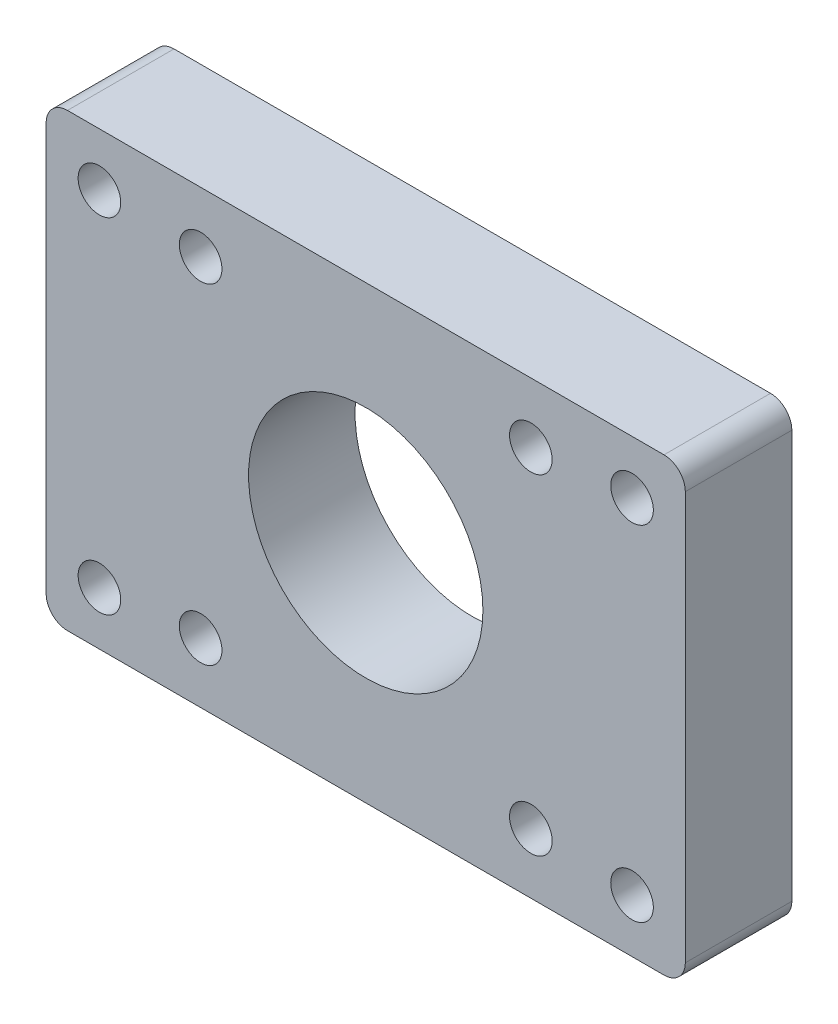
ISO-10303-21;
HEADER;
FILE_DESCRIPTION(('STEP AP214'),'2;1');
FILE_NAME('part.step','',(''),(''),'','','');
FILE_SCHEMA(('AUTOMOTIVE_DESIGN { 1 0 10303 214 1 1 1 1 }'));
ENDSEC;
DATA;
#1=APPLICATION_CONTEXT('core data for automotive mechanical design processes');
#2=APPLICATION_PROTOCOL_DEFINITION('international standard','automotive_design',2000,#1);
#3=PRODUCT_CONTEXT('',#1,'mechanical');
#4=PRODUCT('Part','Part','',(#3));
#5=PRODUCT_RELATED_PRODUCT_CATEGORY('part','',(#4));
#6=PRODUCT_DEFINITION_FORMATION('','',#4);
#7=PRODUCT_DEFINITION_CONTEXT('part definition',#1,'design');
#8=PRODUCT_DEFINITION('design','',#6,#7);
#9=PRODUCT_DEFINITION_SHAPE('','',#8);
#10=(LENGTH_UNIT() NAMED_UNIT(*) SI_UNIT(.MILLI.,.METRE.));
#11=(NAMED_UNIT(*) PLANE_ANGLE_UNIT() SI_UNIT($,.RADIAN.));
#12=(NAMED_UNIT(*) SI_UNIT($,.STERADIAN.) SOLID_ANGLE_UNIT());
#13=UNCERTAINTY_MEASURE_WITH_UNIT(LENGTH_MEASURE(1.E-05),#10,'distance_accuracy_value','');
#14=(GEOMETRIC_REPRESENTATION_CONTEXT(3) GLOBAL_UNCERTAINTY_ASSIGNED_CONTEXT((#13)) GLOBAL_UNIT_ASSIGNED_CONTEXT((#10,
#11,#12)) REPRESENTATION_CONTEXT('',''));
#15=CARTESIAN_POINT('',(0.,0.,0.));
#16=DIRECTION('',(0.,0.,1.));
#17=DIRECTION('',(1.,0.,0.));
#18=AXIS2_PLACEMENT_3D('',#15,#16,#17);
#19=CARTESIAN_POINT('',(0.,0.,10.));
#20=DIRECTION('',(0.,0.,-1.));
#21=DIRECTION('',(-1.,0.,0.));
#22=AXIS2_PLACEMENT_3D('',#19,#20,#21);
#23=PLANE('',#22);
#24=CARTESIAN_POINT('',(0.,0.,10.));
#25=DIRECTION('',(0.,0.,1.));
#26=DIRECTION('',(1.,0.,0.));
#27=AXIS2_PLACEMENT_3D('',#24,#25,#26);
#28=CIRCLE('',#27,11.);
#29=CARTESIAN_POINT('',(11.,0.,10.));
#30=VERTEX_POINT('',#29);
#31=EDGE_CURVE('E268',#30,#30,#28,.T.);
#32=ORIENTED_EDGE('',*,*,#31,.F.);
#33=EDGE_LOOP('',(#32));
#34=FACE_BOUND('',#33,.T.);
#35=DIRECTION('',(0.,-1.,0.));
#36=VECTOR('',#35,1.);
#37=CARTESIAN_POINT('',(-30.,-21.15,10.));
#38=LINE('',#37,#36);
#39=CARTESIAN_POINT('',(-30.,19.15,10.));
#40=VERTEX_POINT('',#39);
#41=CARTESIAN_POINT('',(-30.,-19.15,10.));
#42=VERTEX_POINT('',#41);
#43=EDGE_CURVE('E196',#40,#42,#38,.T.);
#44=ORIENTED_EDGE('',*,*,#43,.T.);
#45=CARTESIAN_POINT('',(-28.,-19.15,10.));
#46=DIRECTION('',(0.,0.,-1.));
#47=DIRECTION('',(-1.,0.,0.));
#48=AXIS2_PLACEMENT_3D('',#45,#46,#47);
#49=CIRCLE('',#48,2.);
#50=CARTESIAN_POINT('',(-28.,-21.15,10.));
#51=VERTEX_POINT('',#50);
#52=EDGE_CURVE('E175',#42,#51,#49,.F.);
#53=ORIENTED_EDGE('',*,*,#52,.T.);
#54=DIRECTION('',(1.,0.,0.));
#55=VECTOR('',#54,1.);
#56=CARTESIAN_POINT('',(-30.,-21.15,10.));
#57=LINE('',#56,#55);
#58=CARTESIAN_POINT('',(28.,-21.15,10.));
#59=VERTEX_POINT('',#58);
#60=EDGE_CURVE('E134',#51,#59,#57,.T.);
#61=ORIENTED_EDGE('',*,*,#60,.T.);
#62=CARTESIAN_POINT('',(28.,-19.15,10.));
#63=DIRECTION('',(0.,0.,-1.));
#64=DIRECTION('',(-1.,0.,0.));
#65=AXIS2_PLACEMENT_3D('',#62,#63,#64);
#66=CIRCLE('',#65,2.);
#67=CARTESIAN_POINT('',(30.,-19.15,10.));
#68=VERTEX_POINT('',#67);
#69=EDGE_CURVE('E173',#59,#68,#66,.F.);
#70=ORIENTED_EDGE('',*,*,#69,.T.);
#71=DIRECTION('',(0.,1.,0.));
#72=VECTOR('',#71,1.);
#73=CARTESIAN_POINT('',(30.,-21.15,10.));
#74=LINE('',#73,#72);
#75=CARTESIAN_POINT('',(30.,19.15,10.));
#76=VERTEX_POINT('',#75);
#77=EDGE_CURVE('E143',#68,#76,#74,.T.);
#78=ORIENTED_EDGE('',*,*,#77,.T.);
#79=CARTESIAN_POINT('',(28.,19.15,10.));
#80=DIRECTION('',(0.,0.,-1.));
#81=DIRECTION('',(-1.,0.,0.));
#82=AXIS2_PLACEMENT_3D('',#79,#80,#81);
#83=CIRCLE('',#82,2.);
#84=CARTESIAN_POINT('',(28.,21.15,10.));
#85=VERTEX_POINT('',#84);
#86=EDGE_CURVE('E68',#76,#85,#83,.F.);
#87=ORIENTED_EDGE('',*,*,#86,.T.);
#88=DIRECTION('',(-1.,0.,0.));
#89=VECTOR('',#88,1.);
#90=CARTESIAN_POINT('',(-30.,21.15,10.));
#91=LINE('',#90,#89);
#92=CARTESIAN_POINT('',(-28.,21.15,10.));
#93=VERTEX_POINT('',#92);
#94=EDGE_CURVE('E148',#85,#93,#91,.T.);
#95=ORIENTED_EDGE('',*,*,#94,.T.);
#96=CARTESIAN_POINT('',(-28.,19.15,10.));
#97=DIRECTION('',(0.,0.,-1.));
#98=DIRECTION('',(-1.,0.,0.));
#99=AXIS2_PLACEMENT_3D('',#96,#97,#98);
#100=CIRCLE('',#99,2.);
#101=EDGE_CURVE('E169',#93,#40,#100,.F.);
#102=ORIENTED_EDGE('',*,*,#101,.T.);
#103=EDGE_LOOP('',(#44,#53,#61,#70,#78,#87,#95,#102));
#104=FACE_BOUND('',#103,.T.);
#105=CARTESIAN_POINT('',(15.5,15.5,10.));
#106=DIRECTION('',(0.,0.,1.));
#107=DIRECTION('',(1.,0.,0.));
#108=AXIS2_PLACEMENT_3D('',#105,#106,#107);
#109=CIRCLE('',#108,2.);
#110=CARTESIAN_POINT('',(17.5,15.5,10.));
#111=VERTEX_POINT('',#110);
#112=EDGE_CURVE('E192',#111,#111,#109,.T.);
#113=ORIENTED_EDGE('',*,*,#112,.F.);
#114=EDGE_LOOP('',(#113));
#115=FACE_BOUND('',#114,.T.);
#116=CARTESIAN_POINT('',(-15.5,15.5,10.));
#117=DIRECTION('',(0.,0.,1.));
#118=DIRECTION('',(-1.,0.,0.));
#119=AXIS2_PLACEMENT_3D('',#116,#117,#118);
#120=CIRCLE('',#119,2.);
#121=CARTESIAN_POINT('',(-17.5,15.5,10.));
#122=VERTEX_POINT('',#121);
#123=EDGE_CURVE('E208',#122,#122,#120,.T.);
#124=ORIENTED_EDGE('',*,*,#123,.F.);
#125=EDGE_LOOP('',(#124));
#126=FACE_BOUND('',#125,.T.);
#127=CARTESIAN_POINT('',(15.5,-15.5,10.));
#128=DIRECTION('',(0.,0.,1.));
#129=DIRECTION('',(-1.,0.,0.));
#130=AXIS2_PLACEMENT_3D('',#127,#128,#129);
#131=CIRCLE('',#130,2.);
#132=CARTESIAN_POINT('',(13.5,-15.5,10.));
#133=VERTEX_POINT('',#132);
#134=EDGE_CURVE('E216',#133,#133,#131,.T.);
#135=ORIENTED_EDGE('',*,*,#134,.F.);
#136=EDGE_LOOP('',(#135));
#137=FACE_BOUND('',#136,.T.);
#138=CARTESIAN_POINT('',(-15.5,-15.5,10.));
#139=DIRECTION('',(0.,0.,1.));
#140=DIRECTION('',(1.,0.,0.));
#141=AXIS2_PLACEMENT_3D('',#138,#139,#140);
#142=CIRCLE('',#141,2.);
#143=CARTESIAN_POINT('',(-13.5,-15.5,10.));
#144=VERTEX_POINT('',#143);
#145=EDGE_CURVE('E221',#144,#144,#142,.T.);
#146=ORIENTED_EDGE('',*,*,#145,.F.);
#147=EDGE_LOOP('',(#146));
#148=FACE_BOUND('',#147,.T.);
#149=CARTESIAN_POINT('',(25.,16.15,10.));
#150=DIRECTION('',(0.,0.,1.));
#151=DIRECTION('',(1.,0.,0.));
#152=AXIS2_PLACEMENT_3D('',#149,#150,#151);
#153=CIRCLE('',#152,2.);
#154=CARTESIAN_POINT('',(27.,16.15,10.));
#155=VERTEX_POINT('',#154);
#156=EDGE_CURVE('E234',#155,#155,#153,.T.);
#157=ORIENTED_EDGE('',*,*,#156,.F.);
#158=EDGE_LOOP('',(#157));
#159=FACE_BOUND('',#158,.T.);
#160=CARTESIAN_POINT('',(-25.,16.15,10.));
#161=DIRECTION('',(0.,0.,1.));
#162=DIRECTION('',(-1.,0.,0.));
#163=AXIS2_PLACEMENT_3D('',#160,#161,#162);
#164=CIRCLE('',#163,2.);
#165=CARTESIAN_POINT('',(-27.,16.15,10.));
#166=VERTEX_POINT('',#165);
#167=EDGE_CURVE('E238',#166,#166,#164,.T.);
#168=ORIENTED_EDGE('',*,*,#167,.F.);
#169=EDGE_LOOP('',(#168));
#170=FACE_BOUND('',#169,.T.);
#171=CARTESIAN_POINT('',(-25.,-16.15,10.));
#172=DIRECTION('',(0.,0.,1.));
#173=DIRECTION('',(1.,0.,0.));
#174=AXIS2_PLACEMENT_3D('',#171,#172,#173);
#175=CIRCLE('',#174,2.);
#176=CARTESIAN_POINT('',(-23.,-16.15,10.));
#177=VERTEX_POINT('',#176);
#178=EDGE_CURVE('E247',#177,#177,#175,.T.);
#179=ORIENTED_EDGE('',*,*,#178,.F.);
#180=EDGE_LOOP('',(#179));
#181=FACE_BOUND('',#180,.T.);
#182=CARTESIAN_POINT('',(25.,-16.15,10.));
#183=DIRECTION('',(0.,0.,1.));
#184=DIRECTION('',(-1.,0.,0.));
#185=AXIS2_PLACEMENT_3D('',#182,#183,#184);
#186=CIRCLE('',#185,2.);
#187=CARTESIAN_POINT('',(23.,-16.15,10.));
#188=VERTEX_POINT('',#187);
#189=EDGE_CURVE('E258',#188,#188,#186,.T.);
#190=ORIENTED_EDGE('',*,*,#189,.F.);
#191=EDGE_LOOP('',(#190));
#192=FACE_BOUND('',#191,.T.);
#193=ADVANCED_FACE('F44',(#34,#104,#115,#126,#137,#148,#159,#170,#181,#192),#23,.F.);
#194=CARTESIAN_POINT('',(0.,0.,0.));
#195=DIRECTION('',(0.,0.,-1.));
#196=DIRECTION('',(-1.,0.,0.));
#197=AXIS2_PLACEMENT_3D('',#194,#195,#196);
#198=PLANE('',#197);
#199=CARTESIAN_POINT('',(0.,0.,0.));
#200=DIRECTION('',(0.,0.,1.));
#201=DIRECTION('',(1.,0.,0.));
#202=AXIS2_PLACEMENT_3D('',#199,#200,#201);
#203=CIRCLE('',#202,11.);
#204=CARTESIAN_POINT('',(11.,0.,0.));
#205=VERTEX_POINT('',#204);
#206=EDGE_CURVE('E262',#205,#205,#203,.T.);
#207=ORIENTED_EDGE('',*,*,#206,.T.);
#208=EDGE_LOOP('',(#207));
#209=FACE_BOUND('',#208,.T.);
#210=CARTESIAN_POINT('',(-25.,-16.15,0.));
#211=DIRECTION('',(0.,0.,1.));
#212=DIRECTION('',(1.,0.,0.));
#213=AXIS2_PLACEMENT_3D('',#210,#211,#212);
#214=CIRCLE('',#213,2.);
#215=CARTESIAN_POINT('',(-23.,-16.15,0.));
#216=VERTEX_POINT('',#215);
#217=EDGE_CURVE('E252',#216,#216,#214,.T.);
#218=ORIENTED_EDGE('',*,*,#217,.T.);
#219=EDGE_LOOP('',(#218));
#220=FACE_BOUND('',#219,.T.);
#221=CARTESIAN_POINT('',(25.,16.15,0.));
#222=DIRECTION('',(0.,0.,1.));
#223=DIRECTION('',(1.,0.,0.));
#224=AXIS2_PLACEMENT_3D('',#221,#222,#223);
#225=CIRCLE('',#224,2.);
#226=CARTESIAN_POINT('',(27.,16.15,0.));
#227=VERTEX_POINT('',#226);
#228=EDGE_CURVE('E237',#227,#227,#225,.T.);
#229=ORIENTED_EDGE('',*,*,#228,.T.);
#230=EDGE_LOOP('',(#229));
#231=FACE_BOUND('',#230,.T.);
#232=CARTESIAN_POINT('',(15.5,-15.5,0.));
#233=DIRECTION('',(0.,0.,1.));
#234=DIRECTION('',(-1.,0.,0.));
#235=AXIS2_PLACEMENT_3D('',#232,#233,#234);
#236=CIRCLE('',#235,2.);
#237=CARTESIAN_POINT('',(13.5,-15.5,0.));
#238=VERTEX_POINT('',#237);
#239=EDGE_CURVE('E219',#238,#238,#236,.T.);
#240=ORIENTED_EDGE('',*,*,#239,.T.);
#241=EDGE_LOOP('',(#240));
#242=FACE_BOUND('',#241,.T.);
#243=CARTESIAN_POINT('',(15.5,15.5,0.));
#244=DIRECTION('',(0.,0.,1.));
#245=DIRECTION('',(1.,0.,0.));
#246=AXIS2_PLACEMENT_3D('',#243,#244,#245);
#247=CIRCLE('',#246,2.);
#248=CARTESIAN_POINT('',(17.5,15.5,0.));
#249=VERTEX_POINT('',#248);
#250=EDGE_CURVE('E204',#249,#249,#247,.T.);
#251=ORIENTED_EDGE('',*,*,#250,.T.);
#252=EDGE_LOOP('',(#251));
#253=FACE_BOUND('',#252,.T.);
#254=DIRECTION('',(1.,0.,0.));
#255=VECTOR('',#254,1.);
#256=CARTESIAN_POINT('',(-30.,-21.15,0.));
#257=LINE('',#256,#255);
#258=CARTESIAN_POINT('',(-28.,-21.15,0.));
#259=VERTEX_POINT('',#258);
#260=CARTESIAN_POINT('',(28.,-21.15,0.));
#261=VERTEX_POINT('',#260);
#262=EDGE_CURVE('E129',#259,#261,#257,.T.);
#263=ORIENTED_EDGE('',*,*,#262,.F.);
#264=CARTESIAN_POINT('',(-28.,-19.15,0.));
#265=DIRECTION('',(0.,0.,-1.));
#266=DIRECTION('',(-1.,0.,0.));
#267=AXIS2_PLACEMENT_3D('',#264,#265,#266);
#268=CIRCLE('',#267,2.);
#269=CARTESIAN_POINT('',(-30.,-19.15,0.));
#270=VERTEX_POINT('',#269);
#271=EDGE_CURVE('E112',#259,#270,#268,.T.);
#272=ORIENTED_EDGE('',*,*,#271,.T.);
#273=DIRECTION('',(0.,-1.,0.));
#274=VECTOR('',#273,1.);
#275=CARTESIAN_POINT('',(-30.,-21.15,0.));
#276=LINE('',#275,#274);
#277=CARTESIAN_POINT('',(-30.,19.15,0.));
#278=VERTEX_POINT('',#277);
#279=EDGE_CURVE('E142',#278,#270,#276,.T.);
#280=ORIENTED_EDGE('',*,*,#279,.F.);
#281=CARTESIAN_POINT('',(-28.,19.15,0.));
#282=DIRECTION('',(0.,0.,-1.));
#283=DIRECTION('',(-1.,0.,0.));
#284=AXIS2_PLACEMENT_3D('',#281,#282,#283);
#285=CIRCLE('',#284,2.);
#286=CARTESIAN_POINT('',(-28.,21.15,0.));
#287=VERTEX_POINT('',#286);
#288=EDGE_CURVE('E156',#278,#287,#285,.T.);
#289=ORIENTED_EDGE('',*,*,#288,.T.);
#290=DIRECTION('',(-1.,0.,0.));
#291=VECTOR('',#290,1.);
#292=CARTESIAN_POINT('',(-30.,21.15,0.));
#293=LINE('',#292,#291);
#294=CARTESIAN_POINT('',(28.,21.15,0.));
#295=VERTEX_POINT('',#294);
#296=EDGE_CURVE('E146',#295,#287,#293,.T.);
#297=ORIENTED_EDGE('',*,*,#296,.F.);
#298=CARTESIAN_POINT('',(28.,19.15,0.));
#299=DIRECTION('',(0.,0.,-1.));
#300=DIRECTION('',(-1.,0.,0.));
#301=AXIS2_PLACEMENT_3D('',#298,#299,#300);
#302=CIRCLE('',#301,2.);
#303=CARTESIAN_POINT('',(30.,19.15,0.));
#304=VERTEX_POINT('',#303);
#305=EDGE_CURVE('E135',#295,#304,#302,.T.);
#306=ORIENTED_EDGE('',*,*,#305,.T.);
#307=DIRECTION('',(0.,1.,0.));
#308=VECTOR('',#307,1.);
#309=CARTESIAN_POINT('',(30.,-21.15,0.));
#310=LINE('',#309,#308);
#311=CARTESIAN_POINT('',(30.,-19.15,0.));
#312=VERTEX_POINT('',#311);
#313=EDGE_CURVE('E193',#312,#304,#310,.T.);
#314=ORIENTED_EDGE('',*,*,#313,.F.);
#315=CARTESIAN_POINT('',(28.,-19.15,0.));
#316=DIRECTION('',(0.,0.,-1.));
#317=DIRECTION('',(-1.,0.,0.));
#318=AXIS2_PLACEMENT_3D('',#315,#316,#317);
#319=CIRCLE('',#318,2.);
#320=EDGE_CURVE('E122',#312,#261,#319,.T.);
#321=ORIENTED_EDGE('',*,*,#320,.T.);
#322=EDGE_LOOP('',(#263,#272,#280,#289,#297,#306,#314,#321));
#323=FACE_BOUND('',#322,.T.);
#324=CARTESIAN_POINT('',(-15.5,15.5,0.));
#325=DIRECTION('',(0.,0.,1.));
#326=DIRECTION('',(-1.,0.,0.));
#327=AXIS2_PLACEMENT_3D('',#324,#325,#326);
#328=CIRCLE('',#327,2.);
#329=CARTESIAN_POINT('',(-17.5,15.5,0.));
#330=VERTEX_POINT('',#329);
#331=EDGE_CURVE('E215',#330,#330,#328,.T.);
#332=ORIENTED_EDGE('',*,*,#331,.T.);
#333=EDGE_LOOP('',(#332));
#334=FACE_BOUND('',#333,.T.);
#335=CARTESIAN_POINT('',(-15.5,-15.5,0.));
#336=DIRECTION('',(0.,0.,1.));
#337=DIRECTION('',(1.,0.,0.));
#338=AXIS2_PLACEMENT_3D('',#335,#336,#337);
#339=CIRCLE('',#338,2.);
#340=CARTESIAN_POINT('',(-13.5,-15.5,0.));
#341=VERTEX_POINT('',#340);
#342=EDGE_CURVE('E227',#341,#341,#339,.T.);
#343=ORIENTED_EDGE('',*,*,#342,.T.);
#344=EDGE_LOOP('',(#343));
#345=FACE_BOUND('',#344,.T.);
#346=CARTESIAN_POINT('',(-25.,16.15,0.));
#347=DIRECTION('',(0.,0.,1.));
#348=DIRECTION('',(-1.,0.,0.));
#349=AXIS2_PLACEMENT_3D('',#346,#347,#348);
#350=CIRCLE('',#349,2.);
#351=CARTESIAN_POINT('',(-27.,16.15,0.));
#352=VERTEX_POINT('',#351);
#353=EDGE_CURVE('E245',#352,#352,#350,.T.);
#354=ORIENTED_EDGE('',*,*,#353,.T.);
#355=EDGE_LOOP('',(#354));
#356=FACE_BOUND('',#355,.T.);
#357=CARTESIAN_POINT('',(25.,-16.15,0.));
#358=DIRECTION('',(0.,0.,1.));
#359=DIRECTION('',(-1.,0.,0.));
#360=AXIS2_PLACEMENT_3D('',#357,#358,#359);
#361=CIRCLE('',#360,2.);
#362=CARTESIAN_POINT('',(23.,-16.15,0.));
#363=VERTEX_POINT('',#362);
#364=EDGE_CURVE('E257',#363,#363,#361,.T.);
#365=ORIENTED_EDGE('',*,*,#364,.T.);
#366=EDGE_LOOP('',(#365));
#367=FACE_BOUND('',#366,.T.);
#368=ADVANCED_FACE('F139',(#209,#220,#231,#242,#253,#323,#334,#345,#356,#367),#198,.T.);
#369=CARTESIAN_POINT('',(30.,-21.15,10.));
#370=DIRECTION('',(-1.,0.,0.));
#371=DIRECTION('',(0.,0.,1.));
#372=AXIS2_PLACEMENT_3D('',#369,#370,#371);
#373=PLANE('',#372);
#374=ORIENTED_EDGE('',*,*,#77,.F.);
#375=DIRECTION('',(0.,0.,-1.));
#376=VECTOR('',#375,1.);
#377=CARTESIAN_POINT('',(30.,-19.15,10.));
#378=LINE('',#377,#376);
#379=EDGE_CURVE('E176',#68,#312,#378,.T.);
#380=ORIENTED_EDGE('',*,*,#379,.T.);
#381=ORIENTED_EDGE('',*,*,#313,.T.);
#382=DIRECTION('',(0.,0.,-1.));
#383=VECTOR('',#382,1.);
#384=CARTESIAN_POINT('',(30.,19.15,10.));
#385=LINE('',#384,#383);
#386=EDGE_CURVE('E179',#304,#76,#385,.F.);
#387=ORIENTED_EDGE('',*,*,#386,.T.);
#388=EDGE_LOOP('',(#374,#380,#381,#387));
#389=FACE_BOUND('',#388,.T.);
#390=ADVANCED_FACE('F315',(#389),#373,.F.);
#391=CARTESIAN_POINT('',(-30.,21.15,10.));
#392=DIRECTION('',(0.,-1.,0.));
#393=DIRECTION('',(0.,0.,-1.));
#394=AXIS2_PLACEMENT_3D('',#391,#392,#393);
#395=PLANE('',#394);
#396=ORIENTED_EDGE('',*,*,#296,.T.);
#397=DIRECTION('',(0.,0.,-1.));
#398=VECTOR('',#397,1.);
#399=CARTESIAN_POINT('',(-28.,21.15,10.));
#400=LINE('',#399,#398);
#401=EDGE_CURVE('E11',#287,#93,#400,.F.);
#402=ORIENTED_EDGE('',*,*,#401,.T.);
#403=ORIENTED_EDGE('',*,*,#94,.F.);
#404=DIRECTION('',(0.,0.,-1.));
#405=VECTOR('',#404,1.);
#406=CARTESIAN_POINT('',(28.,21.15,10.));
#407=LINE('',#406,#405);
#408=EDGE_CURVE('E53',#85,#295,#407,.T.);
#409=ORIENTED_EDGE('',*,*,#408,.T.);
#410=EDGE_LOOP('',(#396,#402,#403,#409));
#411=FACE_BOUND('',#410,.T.);
#412=ADVANCED_FACE('F189',(#411),#395,.F.);
#413=CARTESIAN_POINT('',(-30.,-21.15,10.));
#414=DIRECTION('',(1.,0.,0.));
#415=DIRECTION('',(0.,0.,-1.));
#416=AXIS2_PLACEMENT_3D('',#413,#414,#415);
#417=PLANE('',#416);
#418=ORIENTED_EDGE('',*,*,#279,.T.);
#419=DIRECTION('',(0.,0.,-1.));
#420=VECTOR('',#419,1.);
#421=CARTESIAN_POINT('',(-30.,-19.15,10.));
#422=LINE('',#421,#420);
#423=EDGE_CURVE('E118',#270,#42,#422,.F.);
#424=ORIENTED_EDGE('',*,*,#423,.T.);
#425=ORIENTED_EDGE('',*,*,#43,.F.);
#426=DIRECTION('',(0.,0.,-1.));
#427=VECTOR('',#426,1.);
#428=CARTESIAN_POINT('',(-30.,19.15,10.));
#429=LINE('',#428,#427);
#430=EDGE_CURVE('E124',#40,#278,#429,.T.);
#431=ORIENTED_EDGE('',*,*,#430,.T.);
#432=EDGE_LOOP('',(#418,#424,#425,#431));
#433=FACE_BOUND('',#432,.T.);
#434=ADVANCED_FACE('F322',(#433),#417,.F.);
#435=CARTESIAN_POINT('',(-30.,-21.15,10.));
#436=DIRECTION('',(0.,1.,0.));
#437=DIRECTION('',(0.,0.,1.));
#438=AXIS2_PLACEMENT_3D('',#435,#436,#437);
#439=PLANE('',#438);
#440=ORIENTED_EDGE('',*,*,#60,.F.);
#441=DIRECTION('',(0.,0.,-1.));
#442=VECTOR('',#441,1.);
#443=CARTESIAN_POINT('',(-28.,-21.15,10.));
#444=LINE('',#443,#442);
#445=EDGE_CURVE('E113',#51,#259,#444,.T.);
#446=ORIENTED_EDGE('',*,*,#445,.T.);
#447=ORIENTED_EDGE('',*,*,#262,.T.);
#448=DIRECTION('',(0.,0.,-1.));
#449=VECTOR('',#448,1.);
#450=CARTESIAN_POINT('',(28.,-21.15,10.));
#451=LINE('',#450,#449);
#452=EDGE_CURVE('E131',#261,#59,#451,.F.);
#453=ORIENTED_EDGE('',*,*,#452,.T.);
#454=EDGE_LOOP('',(#440,#446,#447,#453));
#455=FACE_BOUND('',#454,.T.);
#456=ADVANCED_FACE('F126',(#455),#439,.F.);
#457=CARTESIAN_POINT('',(15.5,15.5,10.));
#458=DIRECTION('',(0.,0.,-1.));
#459=DIRECTION('',(-1.,0.,0.));
#460=AXIS2_PLACEMENT_3D('',#457,#458,#459);
#461=CYLINDRICAL_SURFACE('',#460,2.);
#462=ORIENTED_EDGE('',*,*,#112,.T.);
#463=EDGE_LOOP('',(#462));
#464=FACE_BOUND('',#463,.T.);
#465=ORIENTED_EDGE('',*,*,#250,.F.);
#466=EDGE_LOOP('',(#465));
#467=FACE_BOUND('',#466,.T.);
#468=ADVANCED_FACE('F323',(#464,#467),#461,.F.);
#469=CARTESIAN_POINT('',(-15.5,15.5,10.));
#470=DIRECTION('',(0.,0.,-1.));
#471=DIRECTION('',(-1.,0.,0.));
#472=AXIS2_PLACEMENT_3D('',#469,#470,#471);
#473=CYLINDRICAL_SURFACE('',#472,2.);
#474=ORIENTED_EDGE('',*,*,#123,.T.);
#475=EDGE_LOOP('',(#474));
#476=FACE_BOUND('',#475,.T.);
#477=ORIENTED_EDGE('',*,*,#331,.F.);
#478=EDGE_LOOP('',(#477));
#479=FACE_BOUND('',#478,.T.);
#480=ADVANCED_FACE('F430',(#476,#479),#473,.F.);
#481=CARTESIAN_POINT('',(15.5,-15.5,10.));
#482=DIRECTION('',(0.,0.,-1.));
#483=DIRECTION('',(-1.,0.,0.));
#484=AXIS2_PLACEMENT_3D('',#481,#482,#483);
#485=CYLINDRICAL_SURFACE('',#484,2.);
#486=ORIENTED_EDGE('',*,*,#134,.T.);
#487=EDGE_LOOP('',(#486));
#488=FACE_BOUND('',#487,.T.);
#489=ORIENTED_EDGE('',*,*,#239,.F.);
#490=EDGE_LOOP('',(#489));
#491=FACE_BOUND('',#490,.T.);
#492=ADVANCED_FACE('F417',(#488,#491),#485,.F.);
#493=CARTESIAN_POINT('',(-15.5,-15.5,10.));
#494=DIRECTION('',(0.,0.,-1.));
#495=DIRECTION('',(-1.,0.,0.));
#496=AXIS2_PLACEMENT_3D('',#493,#494,#495);
#497=CYLINDRICAL_SURFACE('',#496,2.);
#498=ORIENTED_EDGE('',*,*,#145,.T.);
#499=EDGE_LOOP('',(#498));
#500=FACE_BOUND('',#499,.T.);
#501=ORIENTED_EDGE('',*,*,#342,.F.);
#502=EDGE_LOOP('',(#501));
#503=FACE_BOUND('',#502,.T.);
#504=ADVANCED_FACE('F409',(#500,#503),#497,.F.);
#505=CARTESIAN_POINT('',(25.,16.15,10.));
#506=DIRECTION('',(0.,0.,-1.));
#507=DIRECTION('',(-1.,0.,0.));
#508=AXIS2_PLACEMENT_3D('',#505,#506,#507);
#509=CYLINDRICAL_SURFACE('',#508,2.);
#510=ORIENTED_EDGE('',*,*,#156,.T.);
#511=EDGE_LOOP('',(#510));
#512=FACE_BOUND('',#511,.T.);
#513=ORIENTED_EDGE('',*,*,#228,.F.);
#514=EDGE_LOOP('',(#513));
#515=FACE_BOUND('',#514,.T.);
#516=ADVANCED_FACE('F399',(#512,#515),#509,.F.);
#517=CARTESIAN_POINT('',(-25.,16.15,10.));
#518=DIRECTION('',(0.,0.,-1.));
#519=DIRECTION('',(-1.,0.,0.));
#520=AXIS2_PLACEMENT_3D('',#517,#518,#519);
#521=CYLINDRICAL_SURFACE('',#520,2.);
#522=ORIENTED_EDGE('',*,*,#167,.T.);
#523=EDGE_LOOP('',(#522));
#524=FACE_BOUND('',#523,.T.);
#525=ORIENTED_EDGE('',*,*,#353,.F.);
#526=EDGE_LOOP('',(#525));
#527=FACE_BOUND('',#526,.T.);
#528=ADVANCED_FACE('F390',(#524,#527),#521,.F.);
#529=CARTESIAN_POINT('',(-25.,-16.15,10.));
#530=DIRECTION('',(0.,0.,-1.));
#531=DIRECTION('',(-1.,0.,0.));
#532=AXIS2_PLACEMENT_3D('',#529,#530,#531);
#533=CYLINDRICAL_SURFACE('',#532,2.);
#534=ORIENTED_EDGE('',*,*,#178,.T.);
#535=EDGE_LOOP('',(#534));
#536=FACE_BOUND('',#535,.T.);
#537=ORIENTED_EDGE('',*,*,#217,.F.);
#538=EDGE_LOOP('',(#537));
#539=FACE_BOUND('',#538,.T.);
#540=ADVANCED_FACE('F307',(#536,#539),#533,.F.);
#541=CARTESIAN_POINT('',(25.,-16.15,10.));
#542=DIRECTION('',(0.,0.,-1.));
#543=DIRECTION('',(-1.,0.,0.));
#544=AXIS2_PLACEMENT_3D('',#541,#542,#543);
#545=CYLINDRICAL_SURFACE('',#544,2.);
#546=ORIENTED_EDGE('',*,*,#189,.T.);
#547=EDGE_LOOP('',(#546));
#548=FACE_BOUND('',#547,.T.);
#549=ORIENTED_EDGE('',*,*,#364,.F.);
#550=EDGE_LOOP('',(#549));
#551=FACE_BOUND('',#550,.T.);
#552=ADVANCED_FACE('F283',(#548,#551),#545,.F.);
#553=CARTESIAN_POINT('',(0.,0.,0.));
#554=DIRECTION('',(0.,0.,1.));
#555=DIRECTION('',(1.,0.,0.));
#556=AXIS2_PLACEMENT_3D('',#553,#554,#555);
#557=CYLINDRICAL_SURFACE('',#556,11.);
#558=ORIENTED_EDGE('',*,*,#206,.F.);
#559=EDGE_LOOP('',(#558));
#560=FACE_BOUND('',#559,.T.);
#561=ORIENTED_EDGE('',*,*,#31,.T.);
#562=EDGE_LOOP('',(#561));
#563=FACE_BOUND('',#562,.T.);
#564=ADVANCED_FACE('F279',(#560,#563),#557,.F.);
#565=CARTESIAN_POINT('',(-28.,-19.15,10.));
#566=DIRECTION('',(0.,0.,-1.));
#567=DIRECTION('',(-1.,0.,0.));
#568=AXIS2_PLACEMENT_3D('',#565,#566,#567);
#569=CYLINDRICAL_SURFACE('',#568,2.);
#570=ORIENTED_EDGE('',*,*,#52,.F.);
#571=ORIENTED_EDGE('',*,*,#423,.F.);
#572=ORIENTED_EDGE('',*,*,#271,.F.);
#573=ORIENTED_EDGE('',*,*,#445,.F.);
#574=EDGE_LOOP('',(#570,#571,#572,#573));
#575=FACE_BOUND('',#574,.T.);
#576=ADVANCED_FACE('F111',(#575),#569,.T.);
#577=CARTESIAN_POINT('',(28.,-19.15,10.));
#578=DIRECTION('',(0.,0.,-1.));
#579=DIRECTION('',(-1.,0.,0.));
#580=AXIS2_PLACEMENT_3D('',#577,#578,#579);
#581=CYLINDRICAL_SURFACE('',#580,2.);
#582=ORIENTED_EDGE('',*,*,#69,.F.);
#583=ORIENTED_EDGE('',*,*,#452,.F.);
#584=ORIENTED_EDGE('',*,*,#320,.F.);
#585=ORIENTED_EDGE('',*,*,#379,.F.);
#586=EDGE_LOOP('',(#582,#583,#584,#585));
#587=FACE_BOUND('',#586,.T.);
#588=ADVANCED_FACE('F335',(#587),#581,.T.);
#589=CARTESIAN_POINT('',(-28.,19.15,10.));
#590=DIRECTION('',(0.,0.,-1.));
#591=DIRECTION('',(-1.,0.,0.));
#592=AXIS2_PLACEMENT_3D('',#589,#590,#591);
#593=CYLINDRICAL_SURFACE('',#592,2.);
#594=ORIENTED_EDGE('',*,*,#101,.F.);
#595=ORIENTED_EDGE('',*,*,#401,.F.);
#596=ORIENTED_EDGE('',*,*,#288,.F.);
#597=ORIENTED_EDGE('',*,*,#430,.F.);
#598=EDGE_LOOP('',(#594,#595,#596,#597));
#599=FACE_BOUND('',#598,.T.);
#600=ADVANCED_FACE('F331',(#599),#593,.T.);
#601=CARTESIAN_POINT('',(28.,19.15,10.));
#602=DIRECTION('',(0.,0.,-1.));
#603=DIRECTION('',(-1.,0.,0.));
#604=AXIS2_PLACEMENT_3D('',#601,#602,#603);
#605=CYLINDRICAL_SURFACE('',#604,2.);
#606=ORIENTED_EDGE('',*,*,#86,.F.);
#607=ORIENTED_EDGE('',*,*,#386,.F.);
#608=ORIENTED_EDGE('',*,*,#305,.F.);
#609=ORIENTED_EDGE('',*,*,#408,.F.);
#610=EDGE_LOOP('',(#606,#607,#608,#609));
#611=FACE_BOUND('',#610,.T.);
#612=ADVANCED_FACE('F50',(#611),#605,.T.);
#613=CLOSED_SHELL('',(#193,#368,#390,#412,#434,#456,#468,#480,#492,#504,#516,#528,#540,#552,
#564,#576,#588,#600,#612));
#614=MANIFOLD_SOLID_BREP('B2',#613);
#615=ADVANCED_BREP_SHAPE_REPRESENTATION('',(#18,#614),#14);
#616=SHAPE_DEFINITION_REPRESENTATION(#9,#615);
ENDSEC;
END-ISO-10303-21;
